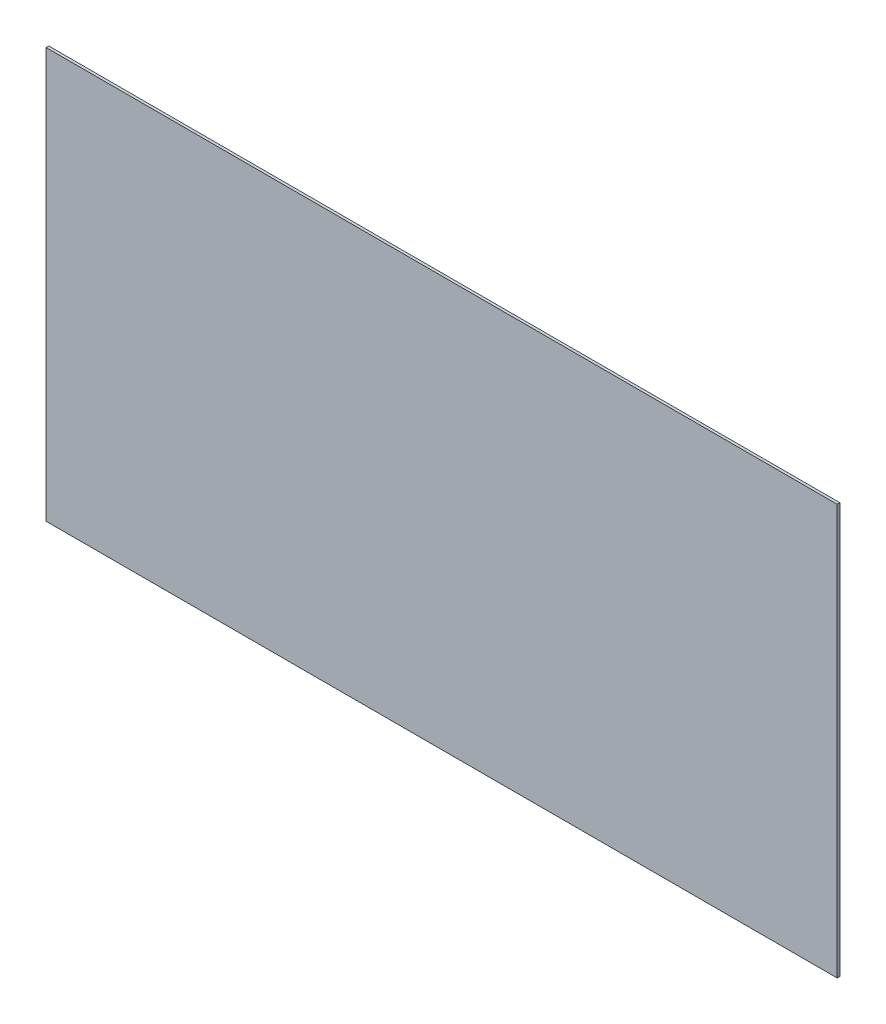
ISO-10303-21;
HEADER;
FILE_DESCRIPTION(('STEP AP214'),'2;1');
FILE_NAME('part.step','',(''),(''),'','','');
FILE_SCHEMA(('AUTOMOTIVE_DESIGN { 1 0 10303 214 1 1 1 1 }'));
ENDSEC;
DATA;
#1=APPLICATION_CONTEXT('core data for automotive mechanical design processes');
#2=APPLICATION_PROTOCOL_DEFINITION('international standard','automotive_design',2000,#1);
#3=PRODUCT_CONTEXT('',#1,'mechanical');
#4=PRODUCT('Part','Part','',(#3));
#5=PRODUCT_RELATED_PRODUCT_CATEGORY('part','',(#4));
#6=PRODUCT_DEFINITION_FORMATION('','',#4);
#7=PRODUCT_DEFINITION_CONTEXT('part definition',#1,'design');
#8=PRODUCT_DEFINITION('design','',#6,#7);
#9=PRODUCT_DEFINITION_SHAPE('','',#8);
#10=(LENGTH_UNIT() NAMED_UNIT(*) SI_UNIT(.MILLI.,.METRE.));
#11=(NAMED_UNIT(*) PLANE_ANGLE_UNIT() SI_UNIT($,.RADIAN.));
#12=(NAMED_UNIT(*) SI_UNIT($,.STERADIAN.) SOLID_ANGLE_UNIT());
#13=UNCERTAINTY_MEASURE_WITH_UNIT(LENGTH_MEASURE(1.E-05),#10,'distance_accuracy_value','');
#14=(GEOMETRIC_REPRESENTATION_CONTEXT(3) GLOBAL_UNCERTAINTY_ASSIGNED_CONTEXT((#13)) GLOBAL_UNIT_ASSIGNED_CONTEXT((#10,
#11,#12)) REPRESENTATION_CONTEXT('',''));
#15=CARTESIAN_POINT('',(0.,0.,0.));
#16=DIRECTION('',(0.,0.,1.));
#17=DIRECTION('',(1.,0.,0.));
#18=AXIS2_PLACEMENT_3D('',#15,#16,#17);
#19=CARTESIAN_POINT('',(0.,0.,1.));
#20=DIRECTION('',(1.,0.,0.));
#21=DIRECTION('',(0.,0.,-1.));
#22=AXIS2_PLACEMENT_3D('',#19,#20,#21);
#23=PLANE('',#22);
#24=DIRECTION('',(0.,-1.,0.));
#25=VECTOR('',#24,1.);
#26=CARTESIAN_POINT('',(0.,0.,0.));
#27=LINE('',#26,#25);
#28=CARTESIAN_POINT('',(0.,153.,0.));
#29=VERTEX_POINT('',#28);
#30=CARTESIAN_POINT('',(0.,0.,0.));
#31=VERTEX_POINT('',#30);
#32=EDGE_CURVE('E98',#29,#31,#27,.T.);
#33=ORIENTED_EDGE('',*,*,#32,.T.);
#34=DIRECTION('',(0.,0.,-1.));
#35=VECTOR('',#34,1.);
#36=CARTESIAN_POINT('',(0.,0.,1.));
#37=LINE('',#36,#35);
#38=CARTESIAN_POINT('',(0.,0.,1.));
#39=VERTEX_POINT('',#38);
#40=EDGE_CURVE('E11',#39,#31,#37,.T.);
#41=ORIENTED_EDGE('',*,*,#40,.F.);
#42=DIRECTION('',(0.,-1.,0.));
#43=VECTOR('',#42,1.);
#44=CARTESIAN_POINT('',(0.,0.,1.));
#45=LINE('',#44,#43);
#46=CARTESIAN_POINT('',(0.,153.,1.));
#47=VERTEX_POINT('',#46);
#48=EDGE_CURVE('E86',#47,#39,#45,.T.);
#49=ORIENTED_EDGE('',*,*,#48,.F.);
#50=DIRECTION('',(0.,0.,-1.));
#51=VECTOR('',#50,1.);
#52=CARTESIAN_POINT('',(0.,153.,1.));
#53=LINE('',#52,#51);
#54=EDGE_CURVE('E94',#47,#29,#53,.T.);
#55=ORIENTED_EDGE('',*,*,#54,.T.);
#56=EDGE_LOOP('',(#33,#41,#49,#55));
#57=FACE_BOUND('',#56,.T.);
#58=ADVANCED_FACE('F35',(#57),#23,.F.);
#59=CARTESIAN_POINT('',(0.,0.,1.));
#60=DIRECTION('',(0.,1.,0.));
#61=DIRECTION('',(0.,0.,1.));
#62=AXIS2_PLACEMENT_3D('',#59,#60,#61);
#63=PLANE('',#62);
#64=DIRECTION('',(1.,0.,0.));
#65=VECTOR('',#64,1.);
#66=CARTESIAN_POINT('',(0.,0.,0.));
#67=LINE('',#66,#65);
#68=CARTESIAN_POINT('',(295.,0.,0.));
#69=VERTEX_POINT('',#68);
#70=EDGE_CURVE('E90',#31,#69,#67,.T.);
#71=ORIENTED_EDGE('',*,*,#70,.T.);
#72=DIRECTION('',(0.,0.,-1.));
#73=VECTOR('',#72,1.);
#74=CARTESIAN_POINT('',(295.,0.,1.));
#75=LINE('',#74,#73);
#76=CARTESIAN_POINT('',(295.,0.,1.));
#77=VERTEX_POINT('',#76);
#78=EDGE_CURVE('E43',#77,#69,#75,.T.);
#79=ORIENTED_EDGE('',*,*,#78,.F.);
#80=DIRECTION('',(1.,0.,0.));
#81=VECTOR('',#80,1.);
#82=CARTESIAN_POINT('',(0.,0.,1.));
#83=LINE('',#82,#81);
#84=EDGE_CURVE('E81',#39,#77,#83,.T.);
#85=ORIENTED_EDGE('',*,*,#84,.F.);
#86=ORIENTED_EDGE('',*,*,#40,.T.);
#87=EDGE_LOOP('',(#71,#79,#85,#86));
#88=FACE_BOUND('',#87,.T.);
#89=ADVANCED_FACE('F89',(#88),#63,.F.);
#90=CARTESIAN_POINT('',(295.,0.,1.));
#91=DIRECTION('',(-1.,0.,0.));
#92=DIRECTION('',(0.,0.,1.));
#93=AXIS2_PLACEMENT_3D('',#90,#91,#92);
#94=PLANE('',#93);
#95=DIRECTION('',(0.,1.,0.));
#96=VECTOR('',#95,1.);
#97=CARTESIAN_POINT('',(295.,0.,0.));
#98=LINE('',#97,#96);
#99=CARTESIAN_POINT('',(295.,153.,0.));
#100=VERTEX_POINT('',#99);
#101=EDGE_CURVE('E68',#69,#100,#98,.T.);
#102=ORIENTED_EDGE('',*,*,#101,.T.);
#103=DIRECTION('',(0.,0.,-1.));
#104=VECTOR('',#103,1.);
#105=CARTESIAN_POINT('',(295.,153.,1.));
#106=LINE('',#105,#104);
#107=CARTESIAN_POINT('',(295.,153.,1.));
#108=VERTEX_POINT('',#107);
#109=EDGE_CURVE('E91',#108,#100,#106,.T.);
#110=ORIENTED_EDGE('',*,*,#109,.F.);
#111=DIRECTION('',(0.,1.,0.));
#112=VECTOR('',#111,1.);
#113=CARTESIAN_POINT('',(295.,0.,1.));
#114=LINE('',#113,#112);
#115=EDGE_CURVE('E84',#77,#108,#114,.T.);
#116=ORIENTED_EDGE('',*,*,#115,.F.);
#117=ORIENTED_EDGE('',*,*,#78,.T.);
#118=EDGE_LOOP('',(#102,#110,#116,#117));
#119=FACE_BOUND('',#118,.T.);
#120=ADVANCED_FACE('F92',(#119),#94,.F.);
#121=CARTESIAN_POINT('',(0.,153.,1.));
#122=DIRECTION('',(0.,-1.,0.));
#123=DIRECTION('',(0.,0.,-1.));
#124=AXIS2_PLACEMENT_3D('',#121,#122,#123);
#125=PLANE('',#124);
#126=DIRECTION('',(-1.,0.,0.));
#127=VECTOR('',#126,1.);
#128=CARTESIAN_POINT('',(0.,153.,0.));
#129=LINE('',#128,#127);
#130=EDGE_CURVE('E74',#100,#29,#129,.T.);
#131=ORIENTED_EDGE('',*,*,#130,.T.);
#132=ORIENTED_EDGE('',*,*,#54,.F.);
#133=DIRECTION('',(-1.,0.,0.));
#134=VECTOR('',#133,1.);
#135=CARTESIAN_POINT('',(0.,153.,1.));
#136=LINE('',#135,#134);
#137=EDGE_CURVE('E51',#108,#47,#136,.T.);
#138=ORIENTED_EDGE('',*,*,#137,.F.);
#139=ORIENTED_EDGE('',*,*,#109,.T.);
#140=EDGE_LOOP('',(#131,#132,#138,#139));
#141=FACE_BOUND('',#140,.T.);
#142=ADVANCED_FACE('F105',(#141),#125,.F.);
#143=CARTESIAN_POINT('',(0.,0.,1.));
#144=DIRECTION('',(0.,0.,-1.));
#145=DIRECTION('',(-1.,0.,0.));
#146=AXIS2_PLACEMENT_3D('',#143,#144,#145);
#147=PLANE('',#146);
#148=ORIENTED_EDGE('',*,*,#48,.T.);
#149=ORIENTED_EDGE('',*,*,#84,.T.);
#150=ORIENTED_EDGE('',*,*,#115,.T.);
#151=ORIENTED_EDGE('',*,*,#137,.T.);
#152=EDGE_LOOP('',(#148,#149,#150,#151));
#153=FACE_BOUND('',#152,.T.);
#154=ADVANCED_FACE('F82',(#153),#147,.F.);
#155=CARTESIAN_POINT('',(0.,0.,0.));
#156=DIRECTION('',(0.,0.,-1.));
#157=DIRECTION('',(-1.,0.,0.));
#158=AXIS2_PLACEMENT_3D('',#155,#156,#157);
#159=PLANE('',#158);
#160=ORIENTED_EDGE('',*,*,#32,.F.);
#161=ORIENTED_EDGE('',*,*,#130,.F.);
#162=ORIENTED_EDGE('',*,*,#101,.F.);
#163=ORIENTED_EDGE('',*,*,#70,.F.);
#164=EDGE_LOOP('',(#160,#161,#162,#163));
#165=FACE_BOUND('',#164,.T.);
#166=ADVANCED_FACE('F108',(#165),#159,.T.);
#167=CLOSED_SHELL('',(#58,#89,#120,#142,#154,#166));
#168=MANIFOLD_SOLID_BREP('B2',#167);
#169=ADVANCED_BREP_SHAPE_REPRESENTATION('',(#18,#168),#14);
#170=SHAPE_DEFINITION_REPRESENTATION(#9,#169);
ENDSEC;
END-ISO-10303-21;
